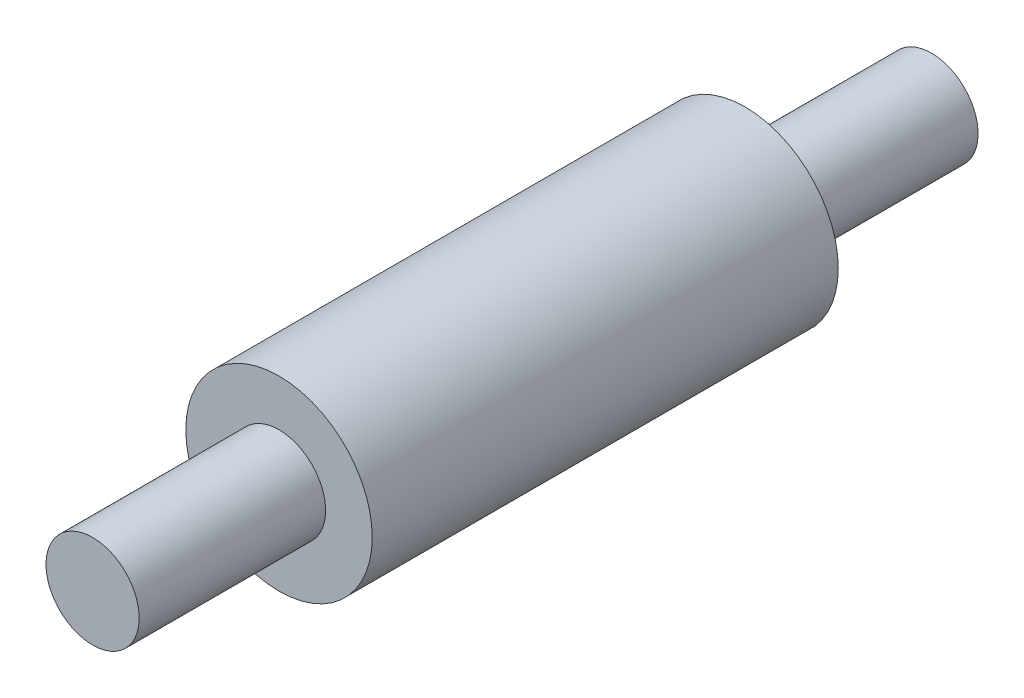
ISO-10303-21;
HEADER;
FILE_DESCRIPTION(('STEP AP214'),'2;1');
FILE_NAME('part.step','',(''),(''),'','','');
FILE_SCHEMA(('AUTOMOTIVE_DESIGN { 1 0 10303 214 1 1 1 1 }'));
ENDSEC;
DATA;
#1=APPLICATION_CONTEXT('core data for automotive mechanical design processes');
#2=APPLICATION_PROTOCOL_DEFINITION('international standard','automotive_design',2000,#1);
#3=PRODUCT_CONTEXT('',#1,'mechanical');
#4=PRODUCT('Part','Part','',(#3));
#5=PRODUCT_RELATED_PRODUCT_CATEGORY('part','',(#4));
#6=PRODUCT_DEFINITION_FORMATION('','',#4);
#7=PRODUCT_DEFINITION_CONTEXT('part definition',#1,'design');
#8=PRODUCT_DEFINITION('design','',#6,#7);
#9=PRODUCT_DEFINITION_SHAPE('','',#8);
#10=(LENGTH_UNIT() NAMED_UNIT(*) SI_UNIT(.MILLI.,.METRE.));
#11=(NAMED_UNIT(*) PLANE_ANGLE_UNIT() SI_UNIT($,.RADIAN.));
#12=(NAMED_UNIT(*) SI_UNIT($,.STERADIAN.) SOLID_ANGLE_UNIT());
#13=UNCERTAINTY_MEASURE_WITH_UNIT(LENGTH_MEASURE(1.E-05),#10,'distance_accuracy_value','');
#14=(GEOMETRIC_REPRESENTATION_CONTEXT(3) GLOBAL_UNCERTAINTY_ASSIGNED_CONTEXT((#13)) GLOBAL_UNIT_ASSIGNED_CONTEXT((#10,
#11,#12)) REPRESENTATION_CONTEXT('',''));
#15=CARTESIAN_POINT('',(0.,0.,0.));
#16=DIRECTION('',(0.,0.,1.));
#17=DIRECTION('',(1.,0.,0.));
#18=AXIS2_PLACEMENT_3D('',#15,#16,#17);
#19=CARTESIAN_POINT('',(0.,0.,57.15));
#20=DIRECTION('',(0.,0.,-1.));
#21=DIRECTION('',(-1.,0.,0.));
#22=AXIS2_PLACEMENT_3D('',#19,#20,#21);
#23=CYLINDRICAL_SURFACE('',#22,6.35);
#24=CARTESIAN_POINT('',(0.,0.,12.7));
#25=DIRECTION('',(0.,0.,-1.));
#26=DIRECTION('',(-1.,0.,0.));
#27=AXIS2_PLACEMENT_3D('',#24,#25,#26);
#28=CIRCLE('',#27,6.35);
#29=CARTESIAN_POINT('',(-6.35,0.,12.7));
#30=VERTEX_POINT('',#29);
#31=EDGE_CURVE('E10',#30,#30,#28,.T.);
#32=ORIENTED_EDGE('',*,*,#31,.F.);
#33=EDGE_LOOP('',(#32));
#34=FACE_BOUND('',#33,.T.);
#35=CARTESIAN_POINT('',(0.,0.,44.45));
#36=DIRECTION('',(0.,0.,-1.));
#37=DIRECTION('',(-1.,0.,0.));
#38=AXIS2_PLACEMENT_3D('',#35,#36,#37);
#39=CIRCLE('',#38,6.35);
#40=CARTESIAN_POINT('',(-6.35,0.,44.45));
#41=VERTEX_POINT('',#40);
#42=EDGE_CURVE('E45',#41,#41,#39,.T.);
#43=ORIENTED_EDGE('',*,*,#42,.T.);
#44=EDGE_LOOP('',(#43));
#45=FACE_BOUND('',#44,.T.);
#46=ADVANCED_FACE('F30',(#34,#45),#23,.T.);
#47=CARTESIAN_POINT('',(0.,0.,12.7));
#48=DIRECTION('',(0.,0.,-1.));
#49=DIRECTION('',(-1.,0.,0.));
#50=AXIS2_PLACEMENT_3D('',#47,#48,#49);
#51=PLANE('',#50);
#52=CARTESIAN_POINT('',(0.,0.,12.7));
#53=DIRECTION('',(0.,0.,-1.));
#54=DIRECTION('',(-1.,0.,0.));
#55=AXIS2_PLACEMENT_3D('',#52,#53,#54);
#56=CIRCLE('',#55,3.175);
#57=CARTESIAN_POINT('',(-3.175,0.,12.7));
#58=VERTEX_POINT('',#57);
#59=EDGE_CURVE('E36',#58,#58,#56,.T.);
#60=ORIENTED_EDGE('',*,*,#59,.F.);
#61=EDGE_LOOP('',(#60));
#62=FACE_BOUND('',#61,.T.);
#63=ORIENTED_EDGE('',*,*,#31,.T.);
#64=EDGE_LOOP('',(#63));
#65=FACE_BOUND('',#64,.T.);
#66=ADVANCED_FACE('F71',(#62,#65),#51,.T.);
#67=CARTESIAN_POINT('',(0.,0.,12.7));
#68=DIRECTION('',(0.,0.,-1.));
#69=DIRECTION('',(-1.,0.,0.));
#70=AXIS2_PLACEMENT_3D('',#67,#68,#69);
#71=CYLINDRICAL_SURFACE('',#70,3.175);
#72=ORIENTED_EDGE('',*,*,#59,.T.);
#73=EDGE_LOOP('',(#72));
#74=FACE_BOUND('',#73,.T.);
#75=CARTESIAN_POINT('',(0.,0.,0.));
#76=DIRECTION('',(0.,0.,-1.));
#77=DIRECTION('',(-1.,0.,0.));
#78=AXIS2_PLACEMENT_3D('',#75,#76,#77);
#79=CIRCLE('',#78,3.175);
#80=CARTESIAN_POINT('',(-3.175,0.,0.));
#81=VERTEX_POINT('',#80);
#82=EDGE_CURVE('E40',#81,#81,#79,.T.);
#83=ORIENTED_EDGE('',*,*,#82,.F.);
#84=EDGE_LOOP('',(#83));
#85=FACE_BOUND('',#84,.T.);
#86=ADVANCED_FACE('F76',(#74,#85),#71,.T.);
#87=CARTESIAN_POINT('',(0.,0.,0.));
#88=DIRECTION('',(0.,0.,1.));
#89=DIRECTION('',(1.,0.,0.));
#90=AXIS2_PLACEMENT_3D('',#87,#88,#89);
#91=PLANE('',#90);
#92=ORIENTED_EDGE('',*,*,#82,.T.);
#93=EDGE_LOOP('',(#92));
#94=FACE_BOUND('',#93,.T.);
#95=ADVANCED_FACE('F82',(#94),#91,.F.);
#96=CARTESIAN_POINT('',(0.,0.,44.45));
#97=DIRECTION('',(0.,0.,1.));
#98=DIRECTION('',(-1.,0.,0.));
#99=AXIS2_PLACEMENT_3D('',#96,#97,#98);
#100=PLANE('',#99);
#101=ORIENTED_EDGE('',*,*,#42,.F.);
#102=EDGE_LOOP('',(#101));
#103=FACE_BOUND('',#102,.T.);
#104=CARTESIAN_POINT('',(0.,0.,44.45));
#105=DIRECTION('',(0.,0.,-1.));
#106=DIRECTION('',(-1.,0.,0.));
#107=AXIS2_PLACEMENT_3D('',#104,#105,#106);
#108=CIRCLE('',#107,3.175);
#109=CARTESIAN_POINT('',(-3.175,0.,44.45));
#110=VERTEX_POINT('',#109);
#111=EDGE_CURVE('E49',#110,#110,#108,.T.);
#112=ORIENTED_EDGE('',*,*,#111,.T.);
#113=EDGE_LOOP('',(#112));
#114=FACE_BOUND('',#113,.T.);
#115=ADVANCED_FACE('F56',(#103,#114),#100,.T.);
#116=CARTESIAN_POINT('',(0.,0.,44.45));
#117=DIRECTION('',(0.,0.,1.));
#118=DIRECTION('',(1.,0.,0.));
#119=AXIS2_PLACEMENT_3D('',#116,#117,#118);
#120=CYLINDRICAL_SURFACE('',#119,3.175);
#121=ORIENTED_EDGE('',*,*,#111,.F.);
#122=EDGE_LOOP('',(#121));
#123=FACE_BOUND('',#122,.T.);
#124=CARTESIAN_POINT('',(0.,0.,57.15));
#125=DIRECTION('',(0.,0.,-1.));
#126=DIRECTION('',(-1.,0.,0.));
#127=AXIS2_PLACEMENT_3D('',#124,#125,#126);
#128=CIRCLE('',#127,3.175);
#129=CARTESIAN_POINT('',(-3.175,0.,57.15));
#130=VERTEX_POINT('',#129);
#131=EDGE_CURVE('E50',#130,#130,#128,.T.);
#132=ORIENTED_EDGE('',*,*,#131,.T.);
#133=EDGE_LOOP('',(#132));
#134=FACE_BOUND('',#133,.T.);
#135=ADVANCED_FACE('F58',(#123,#134),#120,.T.);
#136=CARTESIAN_POINT('',(0.,0.,57.15));
#137=DIRECTION('',(0.,0.,1.));
#138=DIRECTION('',(1.,0.,0.));
#139=AXIS2_PLACEMENT_3D('',#136,#137,#138);
#140=PLANE('',#139);
#141=ORIENTED_EDGE('',*,*,#131,.F.);
#142=EDGE_LOOP('',(#141));
#143=FACE_BOUND('',#142,.T.);
#144=ADVANCED_FACE('F61',(#143),#140,.T.);
#145=CLOSED_SHELL('',(#46,#66,#86,#95,#115,#135,#144));
#146=MANIFOLD_SOLID_BREP('B2',#145);
#147=ADVANCED_BREP_SHAPE_REPRESENTATION('',(#18,#146),#14);
#148=SHAPE_DEFINITION_REPRESENTATION(#9,#147);
ENDSEC;
END-ISO-10303-21;
